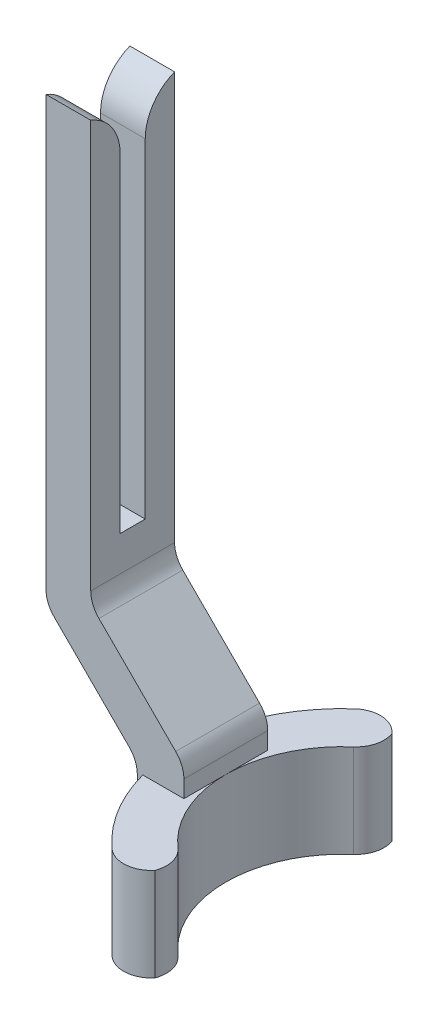
ISO-10303-21;
HEADER;
FILE_DESCRIPTION(('STEP AP214'),'2;1');
FILE_NAME('part.step','',(''),(''),'','','');
FILE_SCHEMA(('AUTOMOTIVE_DESIGN { 1 0 10303 214 1 1 1 1 }'));
ENDSEC;
DATA;
#1=APPLICATION_CONTEXT('core data for automotive mechanical design processes');
#2=APPLICATION_PROTOCOL_DEFINITION('international standard','automotive_design',2000,#1);
#3=PRODUCT_CONTEXT('',#1,'mechanical');
#4=PRODUCT('Part','Part','',(#3));
#5=PRODUCT_RELATED_PRODUCT_CATEGORY('part','',(#4));
#6=PRODUCT_DEFINITION_FORMATION('','',#4);
#7=PRODUCT_DEFINITION_CONTEXT('part definition',#1,'design');
#8=PRODUCT_DEFINITION('design','',#6,#7);
#9=PRODUCT_DEFINITION_SHAPE('','',#8);
#10=(LENGTH_UNIT() NAMED_UNIT(*) SI_UNIT(.MILLI.,.METRE.));
#11=(NAMED_UNIT(*) PLANE_ANGLE_UNIT() SI_UNIT($,.RADIAN.));
#12=(NAMED_UNIT(*) SI_UNIT($,.STERADIAN.) SOLID_ANGLE_UNIT());
#13=UNCERTAINTY_MEASURE_WITH_UNIT(LENGTH_MEASURE(1.E-05),#10,'distance_accuracy_value','');
#14=(GEOMETRIC_REPRESENTATION_CONTEXT(3) GLOBAL_UNCERTAINTY_ASSIGNED_CONTEXT((#13)) GLOBAL_UNIT_ASSIGNED_CONTEXT((#10,
#11,#12)) REPRESENTATION_CONTEXT('',''));
#15=CARTESIAN_POINT('',(0.,0.,0.));
#16=DIRECTION('',(0.,0.,1.));
#17=DIRECTION('',(1.,0.,0.));
#18=AXIS2_PLACEMENT_3D('',#15,#16,#17);
#19=CARTESIAN_POINT('',(0.,0.,0.));
#20=DIRECTION('',(0.,-1.,0.));
#21=DIRECTION('',(0.,0.,-1.));
#22=AXIS2_PLACEMENT_3D('',#19,#20,#21);
#23=PLANE('',#22);
#24=DIRECTION('',(-1.,0.,0.));
#25=VECTOR('',#24,1.);
#26=CARTESIAN_POINT('',(0.,0.,-3.15));
#27=LINE('',#26,#25);
#28=CARTESIAN_POINT('',(4.8,0.,-3.15));
#29=VERTEX_POINT('',#28);
#30=CARTESIAN_POINT('',(0.,0.,-3.15));
#31=VERTEX_POINT('',#30);
#32=EDGE_CURVE('E270',#29,#31,#27,.T.);
#33=ORIENTED_EDGE('',*,*,#32,.F.);
#34=DIRECTION('',(0.,0.,1.));
#35=VECTOR('',#34,1.);
#36=CARTESIAN_POINT('',(4.8,0.,0.));
#37=LINE('',#36,#35);
#38=CARTESIAN_POINT('',(4.8,0.,-5.85));
#39=VERTEX_POINT('',#38);
#40=EDGE_CURVE('E292',#39,#29,#37,.T.);
#41=ORIENTED_EDGE('',*,*,#40,.F.);
#42=DIRECTION('',(-1.,0.,0.));
#43=VECTOR('',#42,1.);
#44=CARTESIAN_POINT('',(0.,0.,-5.85));
#45=LINE('',#44,#43);
#46=CARTESIAN_POINT('',(0.,0.,-5.85));
#47=VERTEX_POINT('',#46);
#48=EDGE_CURVE('E299',#39,#47,#45,.T.);
#49=ORIENTED_EDGE('',*,*,#48,.T.);
#50=DIRECTION('',(0.,0.,-1.));
#51=VECTOR('',#50,1.);
#52=CARTESIAN_POINT('',(0.,0.,0.));
#53=LINE('',#52,#51);
#54=EDGE_CURVE('E289',#31,#47,#53,.T.);
#55=ORIENTED_EDGE('',*,*,#54,.F.);
#56=EDGE_LOOP('',(#33,#41,#49,#55));
#57=FACE_BOUND('',#56,.T.);
#58=ADVANCED_FACE('F42',(#57),#23,.F.);
#59=CARTESIAN_POINT('',(0.,40.,-5.85));
#60=DIRECTION('',(0.,0.,1.));
#61=DIRECTION('',(1.,0.,0.));
#62=AXIS2_PLACEMENT_3D('',#59,#60,#61);
#63=PLANE('',#62);
#64=DIRECTION('',(0.,-1.,0.));
#65=VECTOR('',#64,1.);
#66=CARTESIAN_POINT('',(4.8,40.,-5.85));
#67=LINE('',#66,#65);
#68=CARTESIAN_POINT('',(4.8,35.3548412298394,-5.85));
#69=VERTEX_POINT('',#68);
#70=EDGE_CURVE('E313',#69,#39,#67,.T.);
#71=ORIENTED_EDGE('',*,*,#70,.F.);
#72=DIRECTION('',(1.,0.,0.));
#73=VECTOR('',#72,1.);
#74=CARTESIAN_POINT('',(0.,35.3548412298394,-5.85));
#75=LINE('',#74,#73);
#76=CARTESIAN_POINT('',(0.,35.3548412298394,-5.85));
#77=VERTEX_POINT('',#76);
#78=EDGE_CURVE('E326',#69,#77,#75,.F.);
#79=ORIENTED_EDGE('',*,*,#78,.T.);
#80=DIRECTION('',(0.,-1.,0.));
#81=VECTOR('',#80,1.);
#82=CARTESIAN_POINT('',(0.,40.,-5.85));
#83=LINE('',#82,#81);
#84=EDGE_CURVE('E303',#77,#47,#83,.T.);
#85=ORIENTED_EDGE('',*,*,#84,.T.);
#86=ORIENTED_EDGE('',*,*,#48,.F.);
#87=EDGE_LOOP('',(#71,#79,#85,#86));
#88=FACE_BOUND('',#87,.T.);
#89=ADVANCED_FACE('F414',(#88),#63,.T.);
#90=CARTESIAN_POINT('',(4.8,40.,0.));
#91=DIRECTION('',(-1.,0.,0.));
#92=DIRECTION('',(0.,0.,1.));
#93=AXIS2_PLACEMENT_3D('',#90,#91,#92);
#94=PLANE('',#93);
#95=DIRECTION('',(0.,1.,0.));
#96=VECTOR('',#95,1.);
#97=CARTESIAN_POINT('',(4.8,-5.,0.));
#98=LINE('',#97,#96);
#99=CARTESIAN_POINT('',(4.8,-3.75735931288072,0.));
#100=VERTEX_POINT('',#99);
#101=CARTESIAN_POINT('',(4.8,40.,0.));
#102=VERTEX_POINT('',#101);
#103=EDGE_CURVE('E297',#100,#102,#98,.T.);
#104=ORIENTED_EDGE('',*,*,#103,.F.);
#105=DIRECTION('',(0.,0.,1.));
#106=VECTOR('',#105,1.);
#107=CARTESIAN_POINT('',(4.8,-3.75735931288072,-9.));
#108=LINE('',#107,#106);
#109=CARTESIAN_POINT('',(4.8,-3.75735931288072,-9.));
#110=VERTEX_POINT('',#109);
#111=EDGE_CURVE('E379',#100,#110,#108,.F.);
#112=ORIENTED_EDGE('',*,*,#111,.T.);
#113=DIRECTION('',(0.,-1.,0.));
#114=VECTOR('',#113,1.);
#115=CARTESIAN_POINT('',(4.8,40.,-9.));
#116=LINE('',#115,#114);
#117=CARTESIAN_POINT('',(4.8,40.,-9.));
#118=VERTEX_POINT('',#117);
#119=EDGE_CURVE('E310',#118,#110,#116,.T.);
#120=ORIENTED_EDGE('',*,*,#119,.F.);
#121=CARTESIAN_POINT('',(4.8,35.3548412298394,-10.85));
#122=DIRECTION('',(-1.,0.,0.));
#123=DIRECTION('',(0.,0.,1.));
#124=AXIS2_PLACEMENT_3D('',#121,#122,#123);
#125=CIRCLE('',#124,5.);
#126=EDGE_CURVE('E321',#118,#69,#125,.F.);
#127=ORIENTED_EDGE('',*,*,#126,.T.);
#128=ORIENTED_EDGE('',*,*,#70,.T.);
#129=ORIENTED_EDGE('',*,*,#40,.T.);
#130=DIRECTION('',(0.,-1.,0.));
#131=VECTOR('',#130,1.);
#132=CARTESIAN_POINT('',(4.8,40.,-3.15));
#133=LINE('',#132,#131);
#134=CARTESIAN_POINT('',(4.8,35.3548412298394,-3.15));
#135=VERTEX_POINT('',#134);
#136=EDGE_CURVE('E287',#135,#29,#133,.T.);
#137=ORIENTED_EDGE('',*,*,#136,.F.);
#138=CARTESIAN_POINT('',(4.8,35.3548412298394,1.85));
#139=DIRECTION('',(-1.,0.,0.));
#140=DIRECTION('',(0.,0.,1.));
#141=AXIS2_PLACEMENT_3D('',#138,#139,#140);
#142=CIRCLE('',#141,5.);
#143=EDGE_CURVE('E323',#135,#102,#142,.F.);
#144=ORIENTED_EDGE('',*,*,#143,.T.);
#145=EDGE_LOOP('',(#104,#112,#120,#127,#128,#129,#137,#144));
#146=FACE_BOUND('',#145,.T.);
#147=ADVANCED_FACE('F419',(#146),#94,.F.);
#148=CARTESIAN_POINT('',(0.,40.,-9.));
#149=DIRECTION('',(0.,0.,-1.));
#150=DIRECTION('',(-1.,0.,0.));
#151=AXIS2_PLACEMENT_3D('',#148,#149,#150);
#152=PLANE('',#151);
#153=DIRECTION('',(0.707106781186548,-0.707106781186547,0.));
#154=VECTOR('',#153,1.);
#155=CARTESIAN_POINT('',(-3.63553390593274,-3.63553390593274,-9.));
#156=LINE('',#155,#154);
#157=CARTESIAN_POINT('',(0.878679656440359,-8.14974746830584,-9.));
#158=VERTEX_POINT('',#157);
#159=CARTESIAN_POINT('',(8.92132034355964,-16.1923881554251,-9.));
#160=VERTEX_POINT('',#159);
#161=EDGE_CURVE('E262',#158,#160,#156,.T.);
#162=ORIENTED_EDGE('',*,*,#161,.F.);
#163=CARTESIAN_POINT('',(3.,-6.0284271247462,-9.));
#164=DIRECTION('',(0.,0.,-1.));
#165=DIRECTION('',(-1.,0.,0.));
#166=AXIS2_PLACEMENT_3D('',#163,#164,#165);
#167=CIRCLE('',#166,3.);
#168=CARTESIAN_POINT('',(0.,-6.0284271247462,-9.));
#169=VERTEX_POINT('',#168);
#170=EDGE_CURVE('E372',#158,#169,#167,.T.);
#171=ORIENTED_EDGE('',*,*,#170,.T.);
#172=DIRECTION('',(0.,-1.,0.));
#173=VECTOR('',#172,1.);
#174=CARTESIAN_POINT('',(0.,40.,-9.));
#175=LINE('',#174,#173);
#176=CARTESIAN_POINT('',(0.,40.,-9.));
#177=VERTEX_POINT('',#176);
#178=EDGE_CURVE('E307',#177,#169,#175,.T.);
#179=ORIENTED_EDGE('',*,*,#178,.F.);
#180=DIRECTION('',(1.,0.,0.));
#181=VECTOR('',#180,1.);
#182=CARTESIAN_POINT('',(0.,40.,-9.));
#183=LINE('',#182,#181);
#184=EDGE_CURVE('E300',#177,#118,#183,.T.);
#185=ORIENTED_EDGE('',*,*,#184,.T.);
#186=ORIENTED_EDGE('',*,*,#119,.T.);
#187=CARTESIAN_POINT('',(7.8,-3.75735931288072,-9.));
#188=DIRECTION('',(0.,0.,-1.));
#189=DIRECTION('',(-1.,0.,0.));
#190=AXIS2_PLACEMENT_3D('',#187,#188,#189);
#191=CIRCLE('',#190,3.);
#192=CARTESIAN_POINT('',(5.67867965644036,-5.87867965644036,-9.));
#193=VERTEX_POINT('',#192);
#194=EDGE_CURVE('E387',#110,#193,#191,.F.);
#195=ORIENTED_EDGE('',*,*,#194,.T.);
#196=DIRECTION('',(0.707106781186548,-0.707106781186547,0.));
#197=VECTOR('',#196,1.);
#198=CARTESIAN_POINT('',(-0.100000000000002,-0.100000000000002,-9.));
#199=LINE('',#198,#197);
#200=CARTESIAN_POINT('',(13.9213203435596,-14.1213203435596,-9.));
#201=VERTEX_POINT('',#200);
#202=EDGE_CURVE('E271',#193,#201,#199,.T.);
#203=ORIENTED_EDGE('',*,*,#202,.T.);
#204=CARTESIAN_POINT('',(11.8,-16.2426406871193,-9.));
#205=DIRECTION('',(0.,0.,-1.));
#206=DIRECTION('',(-1.,0.,0.));
#207=AXIS2_PLACEMENT_3D('',#204,#205,#206);
#208=CIRCLE('',#207,3.);
#209=CARTESIAN_POINT('',(14.8,-16.2426406871193,-9.));
#210=VERTEX_POINT('',#209);
#211=EDGE_CURVE('E65',#201,#210,#208,.T.);
#212=ORIENTED_EDGE('',*,*,#211,.T.);
#213=DIRECTION('',(0.,-1.,0.));
#214=VECTOR('',#213,1.);
#215=CARTESIAN_POINT('',(14.8,0.,-9.));
#216=LINE('',#215,#214);
#217=CARTESIAN_POINT('',(14.8,-18.0710678118655,-9.00000000000001));
#218=VERTEX_POINT('',#217);
#219=EDGE_CURVE('E268',#210,#218,#216,.T.);
#220=ORIENTED_EDGE('',*,*,#219,.T.);
#221=DIRECTION('',(-1.,0.,0.));
#222=VECTOR('',#221,1.);
#223=CARTESIAN_POINT('',(0.,-18.0710678118655,-9.));
#224=LINE('',#223,#222);
#225=CARTESIAN_POINT('',(10.3884654747122,-18.0710678118655,-9.));
#226=VERTEX_POINT('',#225);
#227=EDGE_CURVE('E256',#218,#226,#224,.T.);
#228=ORIENTED_EDGE('',*,*,#227,.T.);
#229=DIRECTION('',(0.,1.,0.));
#230=VECTOR('',#229,1.);
#231=CARTESIAN_POINT('',(10.3884654747122,-28.0710678118655,-9.));
#232=LINE('',#231,#230);
#233=CARTESIAN_POINT('',(10.3884654747122,-28.0710678118655,-9.));
#234=VERTEX_POINT('',#233);
#235=EDGE_CURVE('E230',#234,#226,#232,.T.);
#236=ORIENTED_EDGE('',*,*,#235,.F.);
#237=DIRECTION('',(1.,0.,0.));
#238=VECTOR('',#237,1.);
#239=CARTESIAN_POINT('',(0.,-28.0710678118655,-9.));
#240=LINE('',#239,#238);
#241=CARTESIAN_POINT('',(9.8,-28.0710678118655,-9.00000000000001));
#242=VERTEX_POINT('',#241);
#243=EDGE_CURVE('E236',#242,#234,#240,.T.);
#244=ORIENTED_EDGE('',*,*,#243,.F.);
#245=DIRECTION('',(0.,1.,0.));
#246=VECTOR('',#245,1.);
#247=CARTESIAN_POINT('',(9.8,0.,-9.));
#248=LINE('',#247,#246);
#249=CARTESIAN_POINT('',(9.8,-18.3137084989848,-9.));
#250=VERTEX_POINT('',#249);
#251=EDGE_CURVE('E273',#242,#250,#248,.T.);
#252=ORIENTED_EDGE('',*,*,#251,.T.);
#253=CARTESIAN_POINT('',(6.8,-18.3137084989848,-9.));
#254=DIRECTION('',(0.,0.,-1.));
#255=DIRECTION('',(-1.,0.,0.));
#256=AXIS2_PLACEMENT_3D('',#253,#254,#255);
#257=CIRCLE('',#256,3.);
#258=EDGE_CURVE('E11',#250,#160,#257,.F.);
#259=ORIENTED_EDGE('',*,*,#258,.T.);
#260=EDGE_LOOP('',(#162,#171,#179,#185,#186,#195,#203,#212,#220,#228,#236,#244,#252,#259));
#261=FACE_BOUND('',#260,.T.);
#262=ADVANCED_FACE('F394',(#261),#152,.T.);
#263=CARTESIAN_POINT('',(0.,40.,0.));
#264=DIRECTION('',(-1.,0.,0.));
#265=DIRECTION('',(0.,0.,1.));
#266=AXIS2_PLACEMENT_3D('',#263,#264,#265);
#267=PLANE('',#266);
#268=ORIENTED_EDGE('',*,*,#178,.T.);
#269=DIRECTION('',(0.,0.,1.));
#270=VECTOR('',#269,1.);
#271=CARTESIAN_POINT('',(0.,-6.0284271247462,0.));
#272=LINE('',#271,#270);
#273=CARTESIAN_POINT('',(0.,-6.0284271247462,0.));
#274=VERTEX_POINT('',#273);
#275=EDGE_CURVE('E353',#169,#274,#272,.T.);
#276=ORIENTED_EDGE('',*,*,#275,.T.);
#277=DIRECTION('',(0.,1.,0.));
#278=VECTOR('',#277,1.);
#279=CARTESIAN_POINT('',(0.,-5.,0.));
#280=LINE('',#279,#278);
#281=CARTESIAN_POINT('',(0.,40.,0.));
#282=VERTEX_POINT('',#281);
#283=EDGE_CURVE('E295',#274,#282,#280,.T.);
#284=ORIENTED_EDGE('',*,*,#283,.T.);
#285=CARTESIAN_POINT('',(0.,35.3548412298394,1.85));
#286=DIRECTION('',(-1.,0.,0.));
#287=DIRECTION('',(0.,0.,1.));
#288=AXIS2_PLACEMENT_3D('',#285,#286,#287);
#289=CIRCLE('',#288,5.);
#290=CARTESIAN_POINT('',(0.,35.3548412298394,-3.15));
#291=VERTEX_POINT('',#290);
#292=EDGE_CURVE('E317',#282,#291,#289,.T.);
#293=ORIENTED_EDGE('',*,*,#292,.T.);
#294=DIRECTION('',(0.,-1.,0.));
#295=VECTOR('',#294,1.);
#296=CARTESIAN_POINT('',(0.,40.,-3.15));
#297=LINE('',#296,#295);
#298=EDGE_CURVE('E283',#291,#31,#297,.T.);
#299=ORIENTED_EDGE('',*,*,#298,.T.);
#300=ORIENTED_EDGE('',*,*,#54,.T.);
#301=ORIENTED_EDGE('',*,*,#84,.F.);
#302=CARTESIAN_POINT('',(0.,35.3548412298394,-10.85));
#303=DIRECTION('',(-1.,0.,0.));
#304=DIRECTION('',(0.,0.,1.));
#305=AXIS2_PLACEMENT_3D('',#302,#303,#304);
#306=CIRCLE('',#305,5.);
#307=EDGE_CURVE('E315',#77,#177,#306,.T.);
#308=ORIENTED_EDGE('',*,*,#307,.T.);
#309=EDGE_LOOP('',(#268,#276,#284,#293,#299,#300,#301,#308));
#310=FACE_BOUND('',#309,.T.);
#311=ADVANCED_FACE('F406',(#310),#267,.T.);
#312=CARTESIAN_POINT('',(0.,-5.,0.));
#313=DIRECTION('',(0.,0.,-1.));
#314=DIRECTION('',(-1.,0.,0.));
#315=AXIS2_PLACEMENT_3D('',#312,#313,#314);
#316=PLANE('',#315);
#317=ORIENTED_EDGE('',*,*,#283,.F.);
#318=CARTESIAN_POINT('',(3.,-6.0284271247462,0.));
#319=DIRECTION('',(0.,0.,-1.));
#320=DIRECTION('',(-1.,0.,0.));
#321=AXIS2_PLACEMENT_3D('',#318,#319,#320);
#322=CIRCLE('',#321,3.);
#323=CARTESIAN_POINT('',(0.878679656440359,-8.14974746830584,0.));
#324=VERTEX_POINT('',#323);
#325=EDGE_CURVE('E364',#274,#324,#322,.F.);
#326=ORIENTED_EDGE('',*,*,#325,.T.);
#327=DIRECTION('',(0.707106781186548,-0.707106781186547,0.));
#328=VECTOR('',#327,1.);
#329=CARTESIAN_POINT('',(-3.63553390593274,-3.63553390593274,0.));
#330=LINE('',#329,#328);
#331=CARTESIAN_POINT('',(8.92132034355964,-16.1923881554251,0.));
#332=VERTEX_POINT('',#331);
#333=EDGE_CURVE('E253',#324,#332,#330,.T.);
#334=ORIENTED_EDGE('',*,*,#333,.T.);
#335=CARTESIAN_POINT('',(6.8,-18.3137084989848,0.));
#336=DIRECTION('',(0.,0.,-1.));
#337=DIRECTION('',(-1.,0.,0.));
#338=AXIS2_PLACEMENT_3D('',#335,#336,#337);
#339=CIRCLE('',#338,3.);
#340=CARTESIAN_POINT('',(9.8,-18.3137084989848,0.));
#341=VERTEX_POINT('',#340);
#342=EDGE_CURVE('E50',#332,#341,#339,.T.);
#343=ORIENTED_EDGE('',*,*,#342,.T.);
#344=DIRECTION('',(0.,1.,0.));
#345=VECTOR('',#344,1.);
#346=CARTESIAN_POINT('',(9.8,0.,0.));
#347=LINE('',#346,#345);
#348=CARTESIAN_POINT('',(9.8,-28.0710678118655,0.));
#349=VERTEX_POINT('',#348);
#350=EDGE_CURVE('E229',#349,#341,#347,.T.);
#351=ORIENTED_EDGE('',*,*,#350,.F.);
#352=DIRECTION('',(-1.,0.,0.));
#353=VECTOR('',#352,1.);
#354=CARTESIAN_POINT('',(0.,-28.0710678118655,0.));
#355=LINE('',#354,#353);
#356=CARTESIAN_POINT('',(10.3884654747122,-28.0710678118655,0.));
#357=VERTEX_POINT('',#356);
#358=EDGE_CURVE('E212',#357,#349,#355,.T.);
#359=ORIENTED_EDGE('',*,*,#358,.F.);
#360=DIRECTION('',(0.,1.,0.));
#361=VECTOR('',#360,1.);
#362=CARTESIAN_POINT('',(10.3884654747122,-28.0710678118655,0.));
#363=LINE('',#362,#361);
#364=CARTESIAN_POINT('',(10.3884654747122,-18.0710678118655,0.));
#365=VERTEX_POINT('',#364);
#366=EDGE_CURVE('E222',#357,#365,#363,.T.);
#367=ORIENTED_EDGE('',*,*,#366,.T.);
#368=DIRECTION('',(-1.,0.,0.));
#369=VECTOR('',#368,1.);
#370=CARTESIAN_POINT('',(0.,-18.0710678118655,0.));
#371=LINE('',#370,#369);
#372=CARTESIAN_POINT('',(14.8,-18.0710678118655,0.));
#373=VERTEX_POINT('',#372);
#374=EDGE_CURVE('E257',#373,#365,#371,.T.);
#375=ORIENTED_EDGE('',*,*,#374,.F.);
#376=DIRECTION('',(0.,-1.,0.));
#377=VECTOR('',#376,1.);
#378=CARTESIAN_POINT('',(14.8,0.,0.));
#379=LINE('',#378,#377);
#380=CARTESIAN_POINT('',(14.8,-16.2426406871193,0.));
#381=VERTEX_POINT('',#380);
#382=EDGE_CURVE('E261',#381,#373,#379,.T.);
#383=ORIENTED_EDGE('',*,*,#382,.F.);
#384=CARTESIAN_POINT('',(11.8,-16.2426406871193,0.));
#385=DIRECTION('',(0.,0.,-1.));
#386=DIRECTION('',(-1.,0.,0.));
#387=AXIS2_PLACEMENT_3D('',#384,#385,#386);
#388=CIRCLE('',#387,3.);
#389=CARTESIAN_POINT('',(13.9213203435596,-14.1213203435596,0.));
#390=VERTEX_POINT('',#389);
#391=EDGE_CURVE('E362',#381,#390,#388,.F.);
#392=ORIENTED_EDGE('',*,*,#391,.T.);
#393=DIRECTION('',(0.707106781186548,-0.707106781186547,0.));
#394=VECTOR('',#393,1.);
#395=CARTESIAN_POINT('',(-0.100000000000002,-0.100000000000002,0.));
#396=LINE('',#395,#394);
#397=CARTESIAN_POINT('',(5.67867965644036,-5.87867965644036,0.));
#398=VERTEX_POINT('',#397);
#399=EDGE_CURVE('E258',#398,#390,#396,.T.);
#400=ORIENTED_EDGE('',*,*,#399,.F.);
#401=CARTESIAN_POINT('',(7.8,-3.75735931288072,0.));
#402=DIRECTION('',(0.,0.,-1.));
#403=DIRECTION('',(-1.,0.,0.));
#404=AXIS2_PLACEMENT_3D('',#401,#402,#403);
#405=CIRCLE('',#404,3.);
#406=EDGE_CURVE('E385',#398,#100,#405,.T.);
#407=ORIENTED_EDGE('',*,*,#406,.T.);
#408=ORIENTED_EDGE('',*,*,#103,.T.);
#409=DIRECTION('',(1.,0.,0.));
#410=VECTOR('',#409,1.);
#411=CARTESIAN_POINT('',(0.,40.,0.));
#412=LINE('',#411,#410);
#413=EDGE_CURVE('E280',#282,#102,#412,.T.);
#414=ORIENTED_EDGE('',*,*,#413,.F.);
#415=EDGE_LOOP('',(#317,#326,#334,#343,#351,#359,#367,#375,#383,#392,#400,#407,#408,#414));
#416=FACE_BOUND('',#415,.T.);
#417=ADVANCED_FACE('F233',(#416),#316,.F.);
#418=CARTESIAN_POINT('',(0.,40.,-3.15));
#419=DIRECTION('',(0.,0.,1.));
#420=DIRECTION('',(1.,0.,0.));
#421=AXIS2_PLACEMENT_3D('',#418,#419,#420);
#422=PLANE('',#421);
#423=ORIENTED_EDGE('',*,*,#298,.F.);
#424=DIRECTION('',(-1.,0.,0.));
#425=VECTOR('',#424,1.);
#426=CARTESIAN_POINT('',(0.,35.3548412298394,-3.15));
#427=LINE('',#426,#425);
#428=EDGE_CURVE('E319',#291,#135,#427,.F.);
#429=ORIENTED_EDGE('',*,*,#428,.T.);
#430=ORIENTED_EDGE('',*,*,#136,.T.);
#431=ORIENTED_EDGE('',*,*,#32,.T.);
#432=EDGE_LOOP('',(#423,#429,#430,#431));
#433=FACE_BOUND('',#432,.T.);
#434=ADVANCED_FACE('F497',(#433),#422,.F.);
#435=CARTESIAN_POINT('',(9.8,0.,-28.745703678076));
#436=DIRECTION('',(1.,0.,0.));
#437=DIRECTION('',(0.,0.,-1.));
#438=AXIS2_PLACEMENT_3D('',#435,#436,#437);
#439=PLANE('',#438);
#440=ORIENTED_EDGE('',*,*,#350,.T.);
#441=DIRECTION('',(0.,0.,1.));
#442=VECTOR('',#441,1.);
#443=CARTESIAN_POINT('',(9.8,-18.3137084989848,-28.745703678076));
#444=LINE('',#443,#442);
#445=EDGE_CURVE('E57',#341,#250,#444,.F.);
#446=ORIENTED_EDGE('',*,*,#445,.T.);
#447=ORIENTED_EDGE('',*,*,#251,.F.);
#448=DIRECTION('',(0.,0.,-1.));
#449=VECTOR('',#448,1.);
#450=CARTESIAN_POINT('',(9.8,-28.0710678118655,0.));
#451=LINE('',#450,#449);
#452=EDGE_CURVE('E234',#349,#242,#451,.T.);
#453=ORIENTED_EDGE('',*,*,#452,.F.);
#454=EDGE_LOOP('',(#440,#446,#447,#453));
#455=FACE_BOUND('',#454,.T.);
#456=ADVANCED_FACE('F391',(#455),#439,.F.);
#457=CARTESIAN_POINT('',(-3.63553390593274,-3.63553390593274,-28.745703678076));
#458=DIRECTION('',(-0.707106781186547,-0.707106781186548,0.));
#459=DIRECTION('',(0.707106781186548,-0.707106781186547,0.));
#460=AXIS2_PLACEMENT_3D('',#457,#458,#459);
#461=PLANE('',#460);
#462=ORIENTED_EDGE('',*,*,#333,.F.);
#463=DIRECTION('',(0.,0.,1.));
#464=VECTOR('',#463,1.);
#465=CARTESIAN_POINT('',(0.878679656440359,-8.14974746830584,-28.745703678076));
#466=LINE('',#465,#464);
#467=EDGE_CURVE('E369',#324,#158,#466,.F.);
#468=ORIENTED_EDGE('',*,*,#467,.T.);
#469=ORIENTED_EDGE('',*,*,#161,.T.);
#470=DIRECTION('',(0.,0.,1.));
#471=VECTOR('',#470,1.);
#472=CARTESIAN_POINT('',(8.92132034355964,-16.1923881554251,-28.745703678076));
#473=LINE('',#472,#471);
#474=EDGE_CURVE('E366',#160,#332,#473,.T.);
#475=ORIENTED_EDGE('',*,*,#474,.T.);
#476=EDGE_LOOP('',(#462,#468,#469,#475));
#477=FACE_BOUND('',#476,.T.);
#478=ADVANCED_FACE('F398',(#477),#461,.T.);
#479=CARTESIAN_POINT('',(-0.100000000000002,-0.100000000000002,-28.745703678076));
#480=DIRECTION('',(-0.707106781186547,-0.707106781186548,0.));
#481=DIRECTION('',(0.707106781186548,-0.707106781186547,0.));
#482=AXIS2_PLACEMENT_3D('',#479,#480,#481);
#483=PLANE('',#482);
#484=ORIENTED_EDGE('',*,*,#202,.F.);
#485=DIRECTION('',(0.,0.,1.));
#486=VECTOR('',#485,1.);
#487=CARTESIAN_POINT('',(5.67867965644036,-5.87867965644036,0.));
#488=LINE('',#487,#486);
#489=EDGE_CURVE('E376',#193,#398,#488,.T.);
#490=ORIENTED_EDGE('',*,*,#489,.T.);
#491=ORIENTED_EDGE('',*,*,#399,.T.);
#492=DIRECTION('',(0.,0.,1.));
#493=VECTOR('',#492,1.);
#494=CARTESIAN_POINT('',(13.9213203435596,-14.1213203435596,-28.745703678076));
#495=LINE('',#494,#493);
#496=EDGE_CURVE('E374',#390,#201,#495,.F.);
#497=ORIENTED_EDGE('',*,*,#496,.T.);
#498=EDGE_LOOP('',(#484,#490,#491,#497));
#499=FACE_BOUND('',#498,.T.);
#500=ADVANCED_FACE('F429',(#499),#483,.F.);
#501=CARTESIAN_POINT('',(14.8,0.,-28.745703678076));
#502=DIRECTION('',(-1.,0.,0.));
#503=DIRECTION('',(0.,0.,1.));
#504=AXIS2_PLACEMENT_3D('',#501,#502,#503);
#505=PLANE('',#504);
#506=ORIENTED_EDGE('',*,*,#219,.F.);
#507=DIRECTION('',(0.,0.,1.));
#508=VECTOR('',#507,1.);
#509=CARTESIAN_POINT('',(14.8,-16.2426406871193,-28.745703678076));
#510=LINE('',#509,#508);
#511=EDGE_CURVE('E381',#210,#381,#510,.T.);
#512=ORIENTED_EDGE('',*,*,#511,.T.);
#513=ORIENTED_EDGE('',*,*,#382,.T.);
#514=DIRECTION('',(0.,0.,1.));
#515=VECTOR('',#514,1.);
#516=CARTESIAN_POINT('',(14.8,-18.0710678118655,-28.745703678076));
#517=LINE('',#516,#515);
#518=CARTESIAN_POINT('',(14.8,-18.0710678118655,-4.49999999999999));
#519=VERTEX_POINT('',#518);
#520=EDGE_CURVE('E264',#519,#373,#517,.T.);
#521=ORIENTED_EDGE('',*,*,#520,.F.);
#522=EDGE_CURVE('E266',#218,#519,#517,.T.);
#523=ORIENTED_EDGE('',*,*,#522,.F.);
#524=EDGE_LOOP('',(#506,#512,#513,#521,#523));
#525=FACE_BOUND('',#524,.T.);
#526=ADVANCED_FACE('F436',(#525),#505,.F.);
#527=CARTESIAN_POINT('',(0.,-18.0710678118655,0.));
#528=DIRECTION('',(0.,-1.,0.));
#529=DIRECTION('',(0.,0.,-1.));
#530=AXIS2_PLACEMENT_3D('',#527,#528,#529);
#531=PLANE('',#530);
#532=CARTESIAN_POINT('',(17.098470625774,-18.0710678118655,-16.169567191066));
#533=DIRECTION('',(0.,-1.,0.));
#534=DIRECTION('',(0.,0.,-1.));
#535=AXIS2_PLACEMENT_3D('',#532,#533,#534);
#536=CIRCLE('',#535,3.);
#537=CARTESIAN_POINT('',(19.0729601820758,-18.0710678118655,-13.9109412831177));
#538=VERTEX_POINT('',#537);
#539=CARTESIAN_POINT('',(19.9138425191585,-18.0710678118655,-17.2057530344069));
#540=VERTEX_POINT('',#539);
#541=EDGE_CURVE('E329',#538,#540,#536,.F.);
#542=ORIENTED_EDGE('',*,*,#541,.T.);
#543=CARTESIAN_POINT('',(17.6087933090912,-18.0710678118655,-15.2856623753056));
#544=DIRECTION('',(0.,-1.,0.));
#545=DIRECTION('',(0.,0.,-1.));
#546=AXIS2_PLACEMENT_3D('',#543,#544,#545);
#547=CIRCLE('',#546,3.);
#548=CARTESIAN_POINT('',(15.6037160626962,-18.0710678118655,-17.5171787288172));
#549=VERTEX_POINT('',#548);
#550=EDGE_CURVE('E331',#540,#549,#547,.F.);
#551=ORIENTED_EDGE('',*,*,#550,.T.);
#552=CARTESIAN_POINT('',(27.3,-18.0710678118655,-4.49999999999999));
#553=DIRECTION('',(0.,-1.,0.));
#554=DIRECTION('',(0.,0.,-1.));
#555=AXIS2_PLACEMENT_3D('',#552,#553,#554);
#556=CIRCLE('',#555,17.5);
#557=EDGE_CURVE('E248',#226,#549,#556,.T.);
#558=ORIENTED_EDGE('',*,*,#557,.F.);
#559=ORIENTED_EDGE('',*,*,#227,.F.);
#560=ORIENTED_EDGE('',*,*,#522,.T.);
#561=CARTESIAN_POINT('',(27.3,-18.0710678118655,-4.49999999999999));
#562=DIRECTION('',(0.,-1.,0.));
#563=DIRECTION('',(0.,0.,-1.));
#564=AXIS2_PLACEMENT_3D('',#561,#562,#563);
#565=CIRCLE('',#564,12.5);
#566=EDGE_CURVE('E246',#519,#538,#565,.T.);
#567=ORIENTED_EDGE('',*,*,#566,.T.);
#568=EDGE_LOOP('',(#542,#551,#558,#559,#560,#567));
#569=FACE_BOUND('',#568,.T.);
#570=ADVANCED_FACE('F447',(#569),#531,.F.);
#571=CARTESIAN_POINT('',(27.3,-28.0710678118655,-4.49999999999999));
#572=DIRECTION('',(0.,1.,0.));
#573=DIRECTION('',(0.,0.,1.));
#574=AXIS2_PLACEMENT_3D('',#571,#572,#573);
#575=CYLINDRICAL_SURFACE('',#574,12.5);
#576=CARTESIAN_POINT('',(19.0729601820758,-18.0710678118655,4.91094128311771));
#577=VERTEX_POINT('',#576);
#578=EDGE_CURVE('E244',#577,#519,#565,.T.);
#579=ORIENTED_EDGE('',*,*,#578,.F.);
#580=DIRECTION('',(0.,1.,0.));
#581=VECTOR('',#580,1.);
#582=CARTESIAN_POINT('',(19.0729601820758,-28.0710678118655,4.91094128311771));
#583=LINE('',#582,#581);
#584=CARTESIAN_POINT('',(19.0729601820758,-28.0710678118655,4.91094128311771));
#585=VERTEX_POINT('',#584);
#586=EDGE_CURVE('E351',#577,#585,#583,.F.);
#587=ORIENTED_EDGE('',*,*,#586,.T.);
#588=CARTESIAN_POINT('',(27.3,-28.0710678118655,-4.49999999999999));
#589=DIRECTION('',(0.,-1.,0.));
#590=DIRECTION('',(0.,0.,-1.));
#591=AXIS2_PLACEMENT_3D('',#588,#589,#590);
#592=CIRCLE('',#591,12.5);
#593=CARTESIAN_POINT('',(19.0729601820758,-28.0710678118655,-13.9109412831177));
#594=VERTEX_POINT('',#593);
#595=EDGE_CURVE('E219',#585,#594,#592,.T.);
#596=ORIENTED_EDGE('',*,*,#595,.T.);
#597=DIRECTION('',(0.,1.,0.));
#598=VECTOR('',#597,1.);
#599=CARTESIAN_POINT('',(19.0729601820758,-28.0710678118655,-13.9109412831177));
#600=LINE('',#599,#598);
#601=EDGE_CURVE('E349',#594,#538,#600,.T.);
#602=ORIENTED_EDGE('',*,*,#601,.T.);
#603=ORIENTED_EDGE('',*,*,#566,.F.);
#604=EDGE_LOOP('',(#579,#587,#596,#602,#603));
#605=FACE_BOUND('',#604,.T.);
#606=ADVANCED_FACE('F463',(#605),#575,.F.);
#607=CARTESIAN_POINT('',(27.3,-28.0710678118655,-4.49999999999999));
#608=DIRECTION('',(0.,1.,0.));
#609=DIRECTION('',(0.,0.,1.));
#610=AXIS2_PLACEMENT_3D('',#607,#608,#609);
#611=CYLINDRICAL_SURFACE('',#610,17.5);
#612=CARTESIAN_POINT('',(27.3,-28.0710678118655,-4.49999999999999));
#613=DIRECTION('',(0.,-1.,0.));
#614=DIRECTION('',(0.,0.,-1.));
#615=AXIS2_PLACEMENT_3D('',#612,#613,#614);
#616=CIRCLE('',#615,17.5);
#617=CARTESIAN_POINT('',(15.6037160626962,-28.0710678118655,8.51717872881716));
#618=VERTEX_POINT('',#617);
#619=EDGE_CURVE('E207',#618,#357,#616,.T.);
#620=ORIENTED_EDGE('',*,*,#619,.F.);
#621=DIRECTION('',(0.,1.,0.));
#622=VECTOR('',#621,1.);
#623=CARTESIAN_POINT('',(15.6037160626962,-28.0710678118655,8.51717872881716));
#624=LINE('',#623,#622);
#625=CARTESIAN_POINT('',(15.6037160626962,-18.0710678118655,8.51717872881716));
#626=VERTEX_POINT('',#625);
#627=EDGE_CURVE('E343',#618,#626,#624,.T.);
#628=ORIENTED_EDGE('',*,*,#627,.T.);
#629=CARTESIAN_POINT('',(27.3,-18.0710678118655,-4.49999999999999));
#630=DIRECTION('',(0.,-1.,0.));
#631=DIRECTION('',(0.,0.,-1.));
#632=AXIS2_PLACEMENT_3D('',#629,#630,#631);
#633=CIRCLE('',#632,17.5);
#634=EDGE_CURVE('E225',#626,#365,#633,.T.);
#635=ORIENTED_EDGE('',*,*,#634,.T.);
#636=ORIENTED_EDGE('',*,*,#366,.F.);
#637=EDGE_LOOP('',(#620,#628,#635,#636));
#638=FACE_BOUND('',#637,.T.);
#639=ADVANCED_FACE('F223',(#638),#611,.T.);
#640=CARTESIAN_POINT('',(27.3,-28.0710678118655,-4.49999999999999));
#641=DIRECTION('',(0.,1.,0.));
#642=DIRECTION('',(0.,0.,1.));
#643=AXIS2_PLACEMENT_3D('',#640,#641,#642);
#644=CYLINDRICAL_SURFACE('',#643,17.5);
#645=ORIENTED_EDGE('',*,*,#557,.T.);
#646=DIRECTION('',(0.,1.,0.));
#647=VECTOR('',#646,1.);
#648=CARTESIAN_POINT('',(15.6037160626962,-28.0710678118655,-17.5171787288172));
#649=LINE('',#648,#647);
#650=CARTESIAN_POINT('',(15.6037160626962,-28.0710678118655,-17.5171787288172));
#651=VERTEX_POINT('',#650);
#652=EDGE_CURVE('E333',#549,#651,#649,.F.);
#653=ORIENTED_EDGE('',*,*,#652,.T.);
#654=CARTESIAN_POINT('',(27.3,-28.0710678118655,-4.49999999999999));
#655=DIRECTION('',(0.,-1.,0.));
#656=DIRECTION('',(0.,0.,-1.));
#657=AXIS2_PLACEMENT_3D('',#654,#655,#656);
#658=CIRCLE('',#657,17.5);
#659=EDGE_CURVE('E241',#234,#651,#658,.T.);
#660=ORIENTED_EDGE('',*,*,#659,.F.);
#661=ORIENTED_EDGE('',*,*,#235,.T.);
#662=EDGE_LOOP('',(#645,#653,#660,#661));
#663=FACE_BOUND('',#662,.T.);
#664=ADVANCED_FACE('F445',(#663),#644,.T.);
#665=CARTESIAN_POINT('',(0.,-28.0710678118655,0.));
#666=DIRECTION('',(0.,-1.,0.));
#667=DIRECTION('',(0.,0.,-1.));
#668=AXIS2_PLACEMENT_3D('',#665,#666,#667);
#669=PLANE('',#668);
#670=CARTESIAN_POINT('',(17.0984706257739,-28.0710678118655,7.16956719106596));
#671=DIRECTION('',(0.,-1.,0.));
#672=DIRECTION('',(0.,0.,-1.));
#673=AXIS2_PLACEMENT_3D('',#670,#671,#672);
#674=CIRCLE('',#673,3.);
#675=CARTESIAN_POINT('',(19.9138425191585,-28.0710678118655,8.20575303440689));
#676=VERTEX_POINT('',#675);
#677=EDGE_CURVE('E340',#585,#676,#674,.T.);
#678=ORIENTED_EDGE('',*,*,#677,.T.);
#679=CARTESIAN_POINT('',(17.6087933090912,-28.0710678118655,6.28566237530565));
#680=DIRECTION('',(0.,-1.,0.));
#681=DIRECTION('',(0.,0.,-1.));
#682=AXIS2_PLACEMENT_3D('',#679,#680,#681);
#683=CIRCLE('',#682,3.);
#684=EDGE_CURVE('E215',#676,#618,#683,.T.);
#685=ORIENTED_EDGE('',*,*,#684,.T.);
#686=ORIENTED_EDGE('',*,*,#619,.T.);
#687=ORIENTED_EDGE('',*,*,#358,.T.);
#688=ORIENTED_EDGE('',*,*,#452,.T.);
#689=ORIENTED_EDGE('',*,*,#243,.T.);
#690=ORIENTED_EDGE('',*,*,#659,.T.);
#691=CARTESIAN_POINT('',(17.6087933090912,-28.0710678118655,-15.2856623753056));
#692=DIRECTION('',(0.,-1.,0.));
#693=DIRECTION('',(0.,0.,-1.));
#694=AXIS2_PLACEMENT_3D('',#691,#692,#693);
#695=CIRCLE('',#694,3.);
#696=CARTESIAN_POINT('',(19.9138425191585,-28.0710678118655,-17.2057530344069));
#697=VERTEX_POINT('',#696);
#698=EDGE_CURVE('E338',#651,#697,#695,.T.);
#699=ORIENTED_EDGE('',*,*,#698,.T.);
#700=CARTESIAN_POINT('',(17.098470625774,-28.0710678118655,-16.169567191066));
#701=DIRECTION('',(0.,-1.,0.));
#702=DIRECTION('',(0.,0.,-1.));
#703=AXIS2_PLACEMENT_3D('',#700,#701,#702);
#704=CIRCLE('',#703,3.);
#705=EDGE_CURVE('E336',#697,#594,#704,.T.);
#706=ORIENTED_EDGE('',*,*,#705,.T.);
#707=ORIENTED_EDGE('',*,*,#595,.F.);
#708=EDGE_LOOP('',(#678,#685,#686,#687,#688,#689,#690,#699,#706,#707));
#709=FACE_BOUND('',#708,.T.);
#710=ADVANCED_FACE('F209',(#709),#669,.T.);
#711=ORIENTED_EDGE('',*,*,#634,.F.);
#712=CARTESIAN_POINT('',(17.6087933090912,-18.0710678118655,6.28566237530565));
#713=DIRECTION('',(0.,-1.,0.));
#714=DIRECTION('',(0.,0.,-1.));
#715=AXIS2_PLACEMENT_3D('',#712,#713,#714);
#716=CIRCLE('',#715,3.);
#717=CARTESIAN_POINT('',(19.9138425191585,-18.0710678118655,8.20575303440689));
#718=VERTEX_POINT('',#717);
#719=EDGE_CURVE('E347',#626,#718,#716,.F.);
#720=ORIENTED_EDGE('',*,*,#719,.T.);
#721=CARTESIAN_POINT('',(17.0984706257739,-18.0710678118655,7.16956719106596));
#722=DIRECTION('',(0.,-1.,0.));
#723=DIRECTION('',(0.,0.,-1.));
#724=AXIS2_PLACEMENT_3D('',#721,#722,#723);
#725=CIRCLE('',#724,3.);
#726=EDGE_CURVE('E345',#718,#577,#725,.F.);
#727=ORIENTED_EDGE('',*,*,#726,.T.);
#728=ORIENTED_EDGE('',*,*,#578,.T.);
#729=ORIENTED_EDGE('',*,*,#520,.T.);
#730=ORIENTED_EDGE('',*,*,#374,.T.);
#731=EDGE_LOOP('',(#711,#720,#727,#728,#729,#730));
#732=FACE_BOUND('',#731,.T.);
#733=ADVANCED_FACE('F473',(#732),#531,.F.);
#734=CARTESIAN_POINT('',(0.,35.3548412298394,1.85));
#735=DIRECTION('',(-1.,0.,0.));
#736=DIRECTION('',(0.,0.,1.));
#737=AXIS2_PLACEMENT_3D('',#734,#735,#736);
#738=CYLINDRICAL_SURFACE('',#737,5.);
#739=ORIENTED_EDGE('',*,*,#143,.F.);
#740=ORIENTED_EDGE('',*,*,#428,.F.);
#741=ORIENTED_EDGE('',*,*,#292,.F.);
#742=ORIENTED_EDGE('',*,*,#413,.T.);
#743=EDGE_LOOP('',(#739,#740,#741,#742));
#744=FACE_BOUND('',#743,.T.);
#745=ADVANCED_FACE('F476',(#744),#738,.T.);
#746=CARTESIAN_POINT('',(0.,35.3548412298394,-10.85));
#747=DIRECTION('',(-1.,0.,0.));
#748=DIRECTION('',(0.,0.,1.));
#749=AXIS2_PLACEMENT_3D('',#746,#747,#748);
#750=CYLINDRICAL_SURFACE('',#749,5.);
#751=ORIENTED_EDGE('',*,*,#126,.F.);
#752=ORIENTED_EDGE('',*,*,#184,.F.);
#753=ORIENTED_EDGE('',*,*,#307,.F.);
#754=ORIENTED_EDGE('',*,*,#78,.F.);
#755=EDGE_LOOP('',(#751,#752,#753,#754));
#756=FACE_BOUND('',#755,.T.);
#757=ADVANCED_FACE('F411',(#756),#750,.T.);
#758=CARTESIAN_POINT('',(17.098470625774,-28.0710678118655,-16.169567191066));
#759=DIRECTION('',(0.,1.,0.));
#760=DIRECTION('',(0.,0.,1.));
#761=AXIS2_PLACEMENT_3D('',#758,#759,#760);
#762=CYLINDRICAL_SURFACE('',#761,3.);
#763=ORIENTED_EDGE('',*,*,#601,.F.);
#764=ORIENTED_EDGE('',*,*,#705,.F.);
#765=DIRECTION('',(0.,1.,0.));
#766=VECTOR('',#765,1.);
#767=CARTESIAN_POINT('',(19.9138425191585,-23.0710678118655,-17.2057530344069));
#768=LINE('',#767,#766);
#769=EDGE_CURVE('E354',#540,#697,#768,.F.);
#770=ORIENTED_EDGE('',*,*,#769,.F.);
#771=ORIENTED_EDGE('',*,*,#541,.F.);
#772=EDGE_LOOP('',(#763,#764,#770,#771));
#773=FACE_BOUND('',#772,.T.);
#774=ADVANCED_FACE('F459',(#773),#762,.T.);
#775=CARTESIAN_POINT('',(17.6087933090912,-28.0710678118655,-15.2856623753056));
#776=DIRECTION('',(0.,1.,0.));
#777=DIRECTION('',(0.,0.,1.));
#778=AXIS2_PLACEMENT_3D('',#775,#776,#777);
#779=CYLINDRICAL_SURFACE('',#778,3.);
#780=ORIENTED_EDGE('',*,*,#698,.F.);
#781=ORIENTED_EDGE('',*,*,#652,.F.);
#782=ORIENTED_EDGE('',*,*,#550,.F.);
#783=ORIENTED_EDGE('',*,*,#769,.T.);
#784=EDGE_LOOP('',(#780,#781,#782,#783));
#785=FACE_BOUND('',#784,.T.);
#786=ADVANCED_FACE('F453',(#785),#779,.T.);
#787=CARTESIAN_POINT('',(17.0984706257739,-28.0710678118655,7.16956719106596));
#788=DIRECTION('',(0.,1.,0.));
#789=DIRECTION('',(0.,0.,1.));
#790=AXIS2_PLACEMENT_3D('',#787,#788,#789);
#791=CYLINDRICAL_SURFACE('',#790,3.);
#792=DIRECTION('',(0.,1.,0.));
#793=VECTOR('',#792,1.);
#794=CARTESIAN_POINT('',(19.9138425191585,-23.0710678118655,8.20575303440689));
#795=LINE('',#794,#793);
#796=EDGE_CURVE('E357',#676,#718,#795,.T.);
#797=ORIENTED_EDGE('',*,*,#796,.F.);
#798=ORIENTED_EDGE('',*,*,#677,.F.);
#799=ORIENTED_EDGE('',*,*,#586,.F.);
#800=ORIENTED_EDGE('',*,*,#726,.F.);
#801=EDGE_LOOP('',(#797,#798,#799,#800));
#802=FACE_BOUND('',#801,.T.);
#803=ADVANCED_FACE('F468',(#802),#791,.T.);
#804=CARTESIAN_POINT('',(17.6087933090912,-28.0710678118655,6.28566237530565));
#805=DIRECTION('',(0.,1.,0.));
#806=DIRECTION('',(0.,0.,1.));
#807=AXIS2_PLACEMENT_3D('',#804,#805,#806);
#808=CYLINDRICAL_SURFACE('',#807,3.);
#809=ORIENTED_EDGE('',*,*,#684,.F.);
#810=ORIENTED_EDGE('',*,*,#796,.T.);
#811=ORIENTED_EDGE('',*,*,#719,.F.);
#812=ORIENTED_EDGE('',*,*,#627,.F.);
#813=EDGE_LOOP('',(#809,#810,#811,#812));
#814=FACE_BOUND('',#813,.T.);
#815=ADVANCED_FACE('F471',(#814),#808,.T.);
#816=CARTESIAN_POINT('',(3.,-6.0284271247462,0.));
#817=DIRECTION('',(0.,0.,1.));
#818=DIRECTION('',(1.,0.,0.));
#819=AXIS2_PLACEMENT_3D('',#816,#817,#818);
#820=CYLINDRICAL_SURFACE('',#819,3.);
#821=ORIENTED_EDGE('',*,*,#170,.F.);
#822=ORIENTED_EDGE('',*,*,#467,.F.);
#823=ORIENTED_EDGE('',*,*,#325,.F.);
#824=ORIENTED_EDGE('',*,*,#275,.F.);
#825=EDGE_LOOP('',(#821,#822,#823,#824));
#826=FACE_BOUND('',#825,.T.);
#827=ADVANCED_FACE('F401',(#826),#820,.T.);
#828=CARTESIAN_POINT('',(7.8,-3.75735931288072,-28.745703678076));
#829=DIRECTION('',(0.,0.,-1.));
#830=DIRECTION('',(-1.,0.,0.));
#831=AXIS2_PLACEMENT_3D('',#828,#829,#830);
#832=CYLINDRICAL_SURFACE('',#831,3.);
#833=ORIENTED_EDGE('',*,*,#194,.F.);
#834=ORIENTED_EDGE('',*,*,#111,.F.);
#835=ORIENTED_EDGE('',*,*,#406,.F.);
#836=ORIENTED_EDGE('',*,*,#489,.F.);
#837=EDGE_LOOP('',(#833,#834,#835,#836));
#838=FACE_BOUND('',#837,.T.);
#839=ADVANCED_FACE('F426',(#838),#832,.F.);
#840=CARTESIAN_POINT('',(11.8,-16.2426406871193,-28.745703678076));
#841=DIRECTION('',(0.,0.,1.));
#842=DIRECTION('',(1.,0.,0.));
#843=AXIS2_PLACEMENT_3D('',#840,#841,#842);
#844=CYLINDRICAL_SURFACE('',#843,3.);
#845=ORIENTED_EDGE('',*,*,#211,.F.);
#846=ORIENTED_EDGE('',*,*,#496,.F.);
#847=ORIENTED_EDGE('',*,*,#391,.F.);
#848=ORIENTED_EDGE('',*,*,#511,.F.);
#849=EDGE_LOOP('',(#845,#846,#847,#848));
#850=FACE_BOUND('',#849,.T.);
#851=ADVANCED_FACE('F434',(#850),#844,.T.);
#852=CARTESIAN_POINT('',(6.8,-18.3137084989848,-28.745703678076));
#853=DIRECTION('',(0.,0.,1.));
#854=DIRECTION('',(1.,0.,0.));
#855=AXIS2_PLACEMENT_3D('',#852,#853,#854);
#856=CYLINDRICAL_SURFACE('',#855,3.);
#857=ORIENTED_EDGE('',*,*,#258,.F.);
#858=ORIENTED_EDGE('',*,*,#445,.F.);
#859=ORIENTED_EDGE('',*,*,#342,.F.);
#860=ORIENTED_EDGE('',*,*,#474,.F.);
#861=EDGE_LOOP('',(#857,#858,#859,#860));
#862=FACE_BOUND('',#861,.T.);
#863=ADVANCED_FACE('F44',(#862),#856,.F.);
#864=CLOSED_SHELL('',(#58,#89,#147,#262,#311,#417,#434,#456,#478,#500,#526,#570,#606,#639,#664,
#710,#733,#745,#757,#774,#786,#803,#815,#827,#839,#851,#863));
#865=MANIFOLD_SOLID_BREP('B2',#864);
#866=ADVANCED_BREP_SHAPE_REPRESENTATION('',(#18,#865),#14);
#867=SHAPE_DEFINITION_REPRESENTATION(#9,#866);
ENDSEC;
END-ISO-10303-21;
